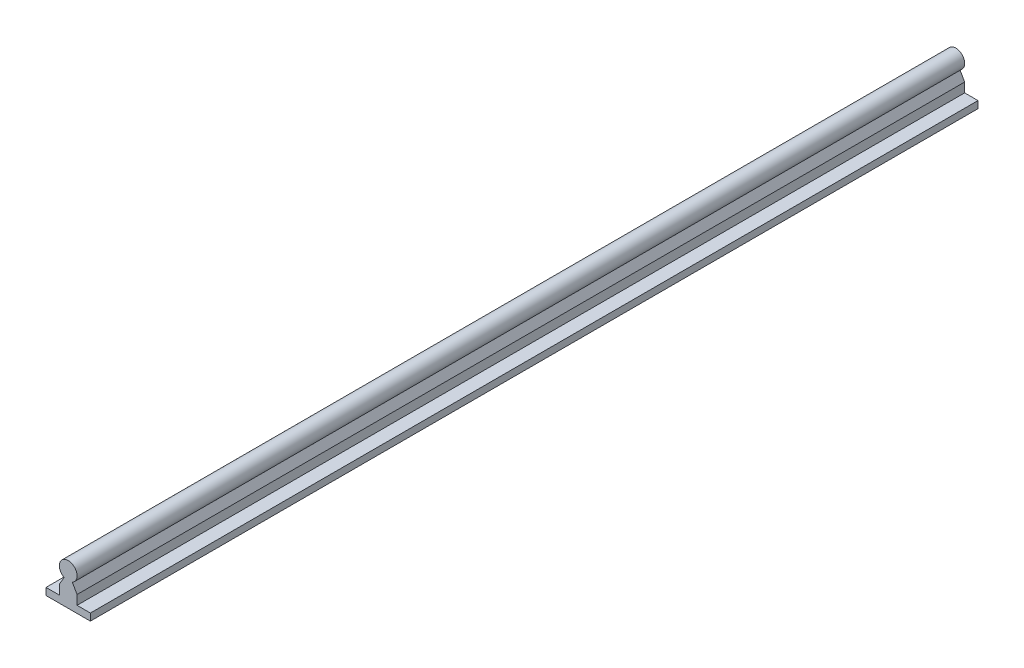
ISO-10303-21;
HEADER;
FILE_DESCRIPTION(('STEP AP214'),'2;1');
FILE_NAME('part.step','',(''),(''),'','','');
FILE_SCHEMA(('AUTOMOTIVE_DESIGN { 1 0 10303 214 1 1 1 1 }'));
ENDSEC;
DATA;
#1=APPLICATION_CONTEXT('core data for automotive mechanical design processes');
#2=APPLICATION_PROTOCOL_DEFINITION('international standard','automotive_design',2000,#1);
#3=PRODUCT_CONTEXT('',#1,'mechanical');
#4=PRODUCT('Part','Part','',(#3));
#5=PRODUCT_RELATED_PRODUCT_CATEGORY('part','',(#4));
#6=PRODUCT_DEFINITION_FORMATION('','',#4);
#7=PRODUCT_DEFINITION_CONTEXT('part definition',#1,'design');
#8=PRODUCT_DEFINITION('design','',#6,#7);
#9=PRODUCT_DEFINITION_SHAPE('','',#8);
#10=(LENGTH_UNIT() NAMED_UNIT(*) SI_UNIT(.MILLI.,.METRE.));
#11=(NAMED_UNIT(*) PLANE_ANGLE_UNIT() SI_UNIT($,.RADIAN.));
#12=(NAMED_UNIT(*) SI_UNIT($,.STERADIAN.) SOLID_ANGLE_UNIT());
#13=UNCERTAINTY_MEASURE_WITH_UNIT(LENGTH_MEASURE(1.E-05),#10,'distance_accuracy_value','');
#14=(GEOMETRIC_REPRESENTATION_CONTEXT(3) GLOBAL_UNCERTAINTY_ASSIGNED_CONTEXT((#13)) GLOBAL_UNIT_ASSIGNED_CONTEXT((#10,
#11,#12)) REPRESENTATION_CONTEXT('',''));
#15=CARTESIAN_POINT('',(0.,0.,0.));
#16=DIRECTION('',(0.,0.,1.));
#17=DIRECTION('',(1.,0.,0.));
#18=AXIS2_PLACEMENT_3D('',#15,#16,#17);
#19=CARTESIAN_POINT('',(0.,22.,600.));
#20=DIRECTION('',(0.,0.,-1.));
#21=DIRECTION('',(-1.,0.,0.));
#22=AXIS2_PLACEMENT_3D('',#19,#20,#21);
#23=CYLINDRICAL_SURFACE('',#22,6.);
#24=CARTESIAN_POINT('',(0.,22.,0.));
#25=DIRECTION('',(0.,0.,1.));
#26=DIRECTION('',(1.,0.,0.));
#27=AXIS2_PLACEMENT_3D('',#24,#25,#26);
#28=CIRCLE('',#27,6.);
#29=CARTESIAN_POINT('',(2.78301876308681,16.6844749493294,0.));
#30=VERTEX_POINT('',#29);
#31=CARTESIAN_POINT('',(-2.78301876308681,16.6844749493294,0.));
#32=VERTEX_POINT('',#31);
#33=EDGE_CURVE('E141',#30,#32,#28,.T.);
#34=ORIENTED_EDGE('',*,*,#33,.T.);
#35=DIRECTION('',(0.,0.,-1.));
#36=VECTOR('',#35,1.);
#37=CARTESIAN_POINT('',(-2.78301876308681,16.6844749493294,600.));
#38=LINE('',#37,#36);
#39=CARTESIAN_POINT('',(-2.78301876308681,16.6844749493294,600.));
#40=VERTEX_POINT('',#39);
#41=EDGE_CURVE('E11',#40,#32,#38,.T.);
#42=ORIENTED_EDGE('',*,*,#41,.F.);
#43=CARTESIAN_POINT('',(0.,22.,600.));
#44=DIRECTION('',(0.,0.,1.));
#45=DIRECTION('',(1.,0.,0.));
#46=AXIS2_PLACEMENT_3D('',#43,#44,#45);
#47=CIRCLE('',#46,6.);
#48=CARTESIAN_POINT('',(2.78301876308681,16.6844749493294,600.));
#49=VERTEX_POINT('',#48);
#50=EDGE_CURVE('E159',#49,#40,#47,.T.);
#51=ORIENTED_EDGE('',*,*,#50,.F.);
#52=DIRECTION('',(0.,0.,-1.));
#53=VECTOR('',#52,1.);
#54=CARTESIAN_POINT('',(2.78301876308681,16.6844749493294,600.));
#55=LINE('',#54,#53);
#56=EDGE_CURVE('E137',#49,#30,#55,.T.);
#57=ORIENTED_EDGE('',*,*,#56,.T.);
#58=EDGE_LOOP('',(#34,#42,#51,#57));
#59=FACE_BOUND('',#58,.T.);
#60=ADVANCED_FACE('F33',(#59),#23,.T.);
#61=CARTESIAN_POINT('',(-6.,11.1125,600.));
#62=DIRECTION('',(0.866025403784438,-0.500000000000001,0.));
#63=DIRECTION('',(0.500000000000001,0.866025403784438,0.));
#64=AXIS2_PLACEMENT_3D('',#61,#62,#63);
#65=PLANE('',#64);
#66=DIRECTION('',(-0.500000000000001,-0.866025403784438,0.));
#67=VECTOR('',#66,1.);
#68=CARTESIAN_POINT('',(-6.,11.1125,0.));
#69=LINE('',#68,#67);
#70=CARTESIAN_POINT('',(-6.,11.1125,0.));
#71=VERTEX_POINT('',#70);
#72=EDGE_CURVE('E144',#32,#71,#69,.T.);
#73=ORIENTED_EDGE('',*,*,#72,.T.);
#74=DIRECTION('',(0.,0.,-1.));
#75=VECTOR('',#74,1.);
#76=CARTESIAN_POINT('',(-6.,11.1125,600.));
#77=LINE('',#76,#75);
#78=CARTESIAN_POINT('',(-6.,11.1125,600.));
#79=VERTEX_POINT('',#78);
#80=EDGE_CURVE('E41',#79,#71,#77,.T.);
#81=ORIENTED_EDGE('',*,*,#80,.F.);
#82=DIRECTION('',(-0.500000000000001,-0.866025403784438,0.));
#83=VECTOR('',#82,1.);
#84=CARTESIAN_POINT('',(-6.,11.1125,600.));
#85=LINE('',#84,#83);
#86=EDGE_CURVE('E98',#40,#79,#85,.T.);
#87=ORIENTED_EDGE('',*,*,#86,.F.);
#88=ORIENTED_EDGE('',*,*,#41,.T.);
#89=EDGE_LOOP('',(#73,#81,#87,#88));
#90=FACE_BOUND('',#89,.T.);
#91=ADVANCED_FACE('F208',(#90),#65,.F.);
#92=CARTESIAN_POINT('',(-6.,4.7625,600.));
#93=DIRECTION('',(1.,0.,0.));
#94=DIRECTION('',(0.,0.,-1.));
#95=AXIS2_PLACEMENT_3D('',#92,#93,#94);
#96=PLANE('',#95);
#97=DIRECTION('',(0.,-1.,0.));
#98=VECTOR('',#97,1.);
#99=CARTESIAN_POINT('',(-6.,4.7625,0.));
#100=LINE('',#99,#98);
#101=CARTESIAN_POINT('',(-6.,4.7625,0.));
#102=VERTEX_POINT('',#101);
#103=EDGE_CURVE('E146',#71,#102,#100,.T.);
#104=ORIENTED_EDGE('',*,*,#103,.T.);
#105=DIRECTION('',(0.,0.,-1.));
#106=VECTOR('',#105,1.);
#107=CARTESIAN_POINT('',(-6.,4.7625,600.));
#108=LINE('',#107,#106);
#109=CARTESIAN_POINT('',(-6.,4.7625,600.));
#110=VERTEX_POINT('',#109);
#111=EDGE_CURVE('E172',#110,#102,#108,.T.);
#112=ORIENTED_EDGE('',*,*,#111,.F.);
#113=DIRECTION('',(0.,-1.,0.));
#114=VECTOR('',#113,1.);
#115=CARTESIAN_POINT('',(-6.,4.7625,600.));
#116=LINE('',#115,#114);
#117=EDGE_CURVE('E180',#79,#110,#116,.T.);
#118=ORIENTED_EDGE('',*,*,#117,.F.);
#119=ORIENTED_EDGE('',*,*,#80,.T.);
#120=EDGE_LOOP('',(#104,#112,#118,#119));
#121=FACE_BOUND('',#120,.T.);
#122=ADVANCED_FACE('F178',(#121),#96,.F.);
#123=CARTESIAN_POINT('',(-15.,4.7625,600.));
#124=DIRECTION('',(0.,-1.,0.));
#125=DIRECTION('',(0.,0.,-1.));
#126=AXIS2_PLACEMENT_3D('',#123,#124,#125);
#127=PLANE('',#126);
#128=DIRECTION('',(-1.,0.,0.));
#129=VECTOR('',#128,1.);
#130=CARTESIAN_POINT('',(-15.,4.7625,0.));
#131=LINE('',#130,#129);
#132=CARTESIAN_POINT('',(-15.,4.7625,0.));
#133=VERTEX_POINT('',#132);
#134=EDGE_CURVE('E148',#102,#133,#131,.T.);
#135=ORIENTED_EDGE('',*,*,#134,.T.);
#136=DIRECTION('',(0.,0.,-1.));
#137=VECTOR('',#136,1.);
#138=CARTESIAN_POINT('',(-15.,4.7625,600.));
#139=LINE('',#138,#137);
#140=CARTESIAN_POINT('',(-15.,4.7625,600.));
#141=VERTEX_POINT('',#140);
#142=EDGE_CURVE('E169',#141,#133,#139,.T.);
#143=ORIENTED_EDGE('',*,*,#142,.F.);
#144=DIRECTION('',(-1.,0.,0.));
#145=VECTOR('',#144,1.);
#146=CARTESIAN_POINT('',(-15.,4.7625,600.));
#147=LINE('',#146,#145);
#148=EDGE_CURVE('E198',#110,#141,#147,.T.);
#149=ORIENTED_EDGE('',*,*,#148,.F.);
#150=ORIENTED_EDGE('',*,*,#111,.T.);
#151=EDGE_LOOP('',(#135,#143,#149,#150));
#152=FACE_BOUND('',#151,.T.);
#153=ADVANCED_FACE('F189',(#152),#127,.F.);
#154=CARTESIAN_POINT('',(-15.,0.,600.));
#155=DIRECTION('',(1.,0.,0.));
#156=DIRECTION('',(0.,0.,-1.));
#157=AXIS2_PLACEMENT_3D('',#154,#155,#156);
#158=PLANE('',#157);
#159=DIRECTION('',(0.,-1.,0.));
#160=VECTOR('',#159,1.);
#161=CARTESIAN_POINT('',(-15.,0.,0.));
#162=LINE('',#161,#160);
#163=CARTESIAN_POINT('',(-15.,0.,0.));
#164=VERTEX_POINT('',#163);
#165=EDGE_CURVE('E150',#133,#164,#162,.T.);
#166=ORIENTED_EDGE('',*,*,#165,.T.);
#167=DIRECTION('',(0.,0.,-1.));
#168=VECTOR('',#167,1.);
#169=CARTESIAN_POINT('',(-15.,0.,600.));
#170=LINE('',#169,#168);
#171=CARTESIAN_POINT('',(-15.,0.,600.));
#172=VERTEX_POINT('',#171);
#173=EDGE_CURVE('E166',#172,#164,#170,.T.);
#174=ORIENTED_EDGE('',*,*,#173,.F.);
#175=DIRECTION('',(0.,-1.,0.));
#176=VECTOR('',#175,1.);
#177=CARTESIAN_POINT('',(-15.,0.,600.));
#178=LINE('',#177,#176);
#179=EDGE_CURVE('E195',#141,#172,#178,.T.);
#180=ORIENTED_EDGE('',*,*,#179,.F.);
#181=ORIENTED_EDGE('',*,*,#142,.T.);
#182=EDGE_LOOP('',(#166,#174,#180,#181));
#183=FACE_BOUND('',#182,.T.);
#184=ADVANCED_FACE('F193',(#183),#158,.F.);
#185=CARTESIAN_POINT('',(15.,0.,600.));
#186=DIRECTION('',(0.,1.,0.));
#187=DIRECTION('',(0.,0.,1.));
#188=AXIS2_PLACEMENT_3D('',#185,#186,#187);
#189=PLANE('',#188);
#190=DIRECTION('',(1.,0.,0.));
#191=VECTOR('',#190,1.);
#192=CARTESIAN_POINT('',(15.,0.,0.));
#193=LINE('',#192,#191);
#194=CARTESIAN_POINT('',(15.,0.,0.));
#195=VERTEX_POINT('',#194);
#196=EDGE_CURVE('E152',#164,#195,#193,.T.);
#197=ORIENTED_EDGE('',*,*,#196,.T.);
#198=DIRECTION('',(0.,0.,-1.));
#199=VECTOR('',#198,1.);
#200=CARTESIAN_POINT('',(15.,0.,600.));
#201=LINE('',#200,#199);
#202=CARTESIAN_POINT('',(15.,0.,600.));
#203=VERTEX_POINT('',#202);
#204=EDGE_CURVE('E163',#203,#195,#201,.T.);
#205=ORIENTED_EDGE('',*,*,#204,.F.);
#206=DIRECTION('',(1.,0.,0.));
#207=VECTOR('',#206,1.);
#208=CARTESIAN_POINT('',(15.,0.,600.));
#209=LINE('',#208,#207);
#210=EDGE_CURVE('E197',#172,#203,#209,.T.);
#211=ORIENTED_EDGE('',*,*,#210,.F.);
#212=ORIENTED_EDGE('',*,*,#173,.T.);
#213=EDGE_LOOP('',(#197,#205,#211,#212));
#214=FACE_BOUND('',#213,.T.);
#215=ADVANCED_FACE('F220',(#214),#189,.F.);
#216=CARTESIAN_POINT('',(15.,0.,600.));
#217=DIRECTION('',(-1.,0.,0.));
#218=DIRECTION('',(0.,0.,1.));
#219=AXIS2_PLACEMENT_3D('',#216,#217,#218);
#220=PLANE('',#219);
#221=DIRECTION('',(0.,1.,0.));
#222=VECTOR('',#221,1.);
#223=CARTESIAN_POINT('',(15.,0.,0.));
#224=LINE('',#223,#222);
#225=CARTESIAN_POINT('',(15.,4.7625,0.));
#226=VERTEX_POINT('',#225);
#227=EDGE_CURVE('E154',#195,#226,#224,.T.);
#228=ORIENTED_EDGE('',*,*,#227,.T.);
#229=DIRECTION('',(0.,0.,-1.));
#230=VECTOR('',#229,1.);
#231=CARTESIAN_POINT('',(15.,4.7625,600.));
#232=LINE('',#231,#230);
#233=CARTESIAN_POINT('',(15.,4.7625,600.));
#234=VERTEX_POINT('',#233);
#235=EDGE_CURVE('E132',#234,#226,#232,.T.);
#236=ORIENTED_EDGE('',*,*,#235,.F.);
#237=DIRECTION('',(0.,1.,0.));
#238=VECTOR('',#237,1.);
#239=CARTESIAN_POINT('',(15.,0.,600.));
#240=LINE('',#239,#238);
#241=EDGE_CURVE('E123',#203,#234,#240,.T.);
#242=ORIENTED_EDGE('',*,*,#241,.F.);
#243=ORIENTED_EDGE('',*,*,#204,.T.);
#244=EDGE_LOOP('',(#228,#236,#242,#243));
#245=FACE_BOUND('',#244,.T.);
#246=ADVANCED_FACE('F223',(#245),#220,.F.);
#247=CARTESIAN_POINT('',(15.,4.7625,600.));
#248=DIRECTION('',(0.,-1.,0.));
#249=DIRECTION('',(0.,0.,-1.));
#250=AXIS2_PLACEMENT_3D('',#247,#248,#249);
#251=PLANE('',#250);
#252=DIRECTION('',(-1.,0.,0.));
#253=VECTOR('',#252,1.);
#254=CARTESIAN_POINT('',(15.,4.7625,0.));
#255=LINE('',#254,#253);
#256=CARTESIAN_POINT('',(6.,4.7625,0.));
#257=VERTEX_POINT('',#256);
#258=EDGE_CURVE('E131',#226,#257,#255,.T.);
#259=ORIENTED_EDGE('',*,*,#258,.T.);
#260=DIRECTION('',(0.,0.,-1.));
#261=VECTOR('',#260,1.);
#262=CARTESIAN_POINT('',(6.,4.7625,600.));
#263=LINE('',#262,#261);
#264=CARTESIAN_POINT('',(6.,4.7625,600.));
#265=VERTEX_POINT('',#264);
#266=EDGE_CURVE('E128',#265,#257,#263,.T.);
#267=ORIENTED_EDGE('',*,*,#266,.F.);
#268=DIRECTION('',(-1.,0.,0.));
#269=VECTOR('',#268,1.);
#270=CARTESIAN_POINT('',(15.,4.7625,600.));
#271=LINE('',#270,#269);
#272=EDGE_CURVE('E117',#234,#265,#271,.T.);
#273=ORIENTED_EDGE('',*,*,#272,.F.);
#274=ORIENTED_EDGE('',*,*,#235,.T.);
#275=EDGE_LOOP('',(#259,#267,#273,#274));
#276=FACE_BOUND('',#275,.T.);
#277=ADVANCED_FACE('F129',(#276),#251,.F.);
#278=CARTESIAN_POINT('',(6.,4.7625,600.));
#279=DIRECTION('',(-1.,0.,0.));
#280=DIRECTION('',(0.,0.,1.));
#281=AXIS2_PLACEMENT_3D('',#278,#279,#280);
#282=PLANE('',#281);
#283=DIRECTION('',(0.,1.,0.));
#284=VECTOR('',#283,1.);
#285=CARTESIAN_POINT('',(6.,4.7625,0.));
#286=LINE('',#285,#284);
#287=CARTESIAN_POINT('',(6.,11.1125,0.));
#288=VERTEX_POINT('',#287);
#289=EDGE_CURVE('E84',#257,#288,#286,.T.);
#290=ORIENTED_EDGE('',*,*,#289,.T.);
#291=DIRECTION('',(0.,0.,-1.));
#292=VECTOR('',#291,1.);
#293=CARTESIAN_POINT('',(6.,11.1125,600.));
#294=LINE('',#293,#292);
#295=CARTESIAN_POINT('',(6.,11.1125,600.));
#296=VERTEX_POINT('',#295);
#297=EDGE_CURVE('E133',#296,#288,#294,.T.);
#298=ORIENTED_EDGE('',*,*,#297,.F.);
#299=DIRECTION('',(0.,1.,0.));
#300=VECTOR('',#299,1.);
#301=CARTESIAN_POINT('',(6.,4.7625,600.));
#302=LINE('',#301,#300);
#303=EDGE_CURVE('E121',#265,#296,#302,.T.);
#304=ORIENTED_EDGE('',*,*,#303,.F.);
#305=ORIENTED_EDGE('',*,*,#266,.T.);
#306=EDGE_LOOP('',(#290,#298,#304,#305));
#307=FACE_BOUND('',#306,.T.);
#308=ADVANCED_FACE('F135',(#307),#282,.F.);
#309=CARTESIAN_POINT('',(6.,11.1125,600.));
#310=DIRECTION('',(-0.866025403784438,-0.500000000000001,0.));
#311=DIRECTION('',(0.500000000000001,-0.866025403784438,0.));
#312=AXIS2_PLACEMENT_3D('',#309,#310,#311);
#313=PLANE('',#312);
#314=DIRECTION('',(-0.500000000000001,0.866025403784438,0.));
#315=VECTOR('',#314,1.);
#316=CARTESIAN_POINT('',(6.,11.1125,0.));
#317=LINE('',#316,#315);
#318=EDGE_CURVE('E90',#288,#30,#317,.T.);
#319=ORIENTED_EDGE('',*,*,#318,.T.);
#320=ORIENTED_EDGE('',*,*,#56,.F.);
#321=DIRECTION('',(-0.500000000000001,0.866025403784438,0.));
#322=VECTOR('',#321,1.);
#323=CARTESIAN_POINT('',(6.,11.1125,600.));
#324=LINE('',#323,#322);
#325=EDGE_CURVE('E49',#296,#49,#324,.T.);
#326=ORIENTED_EDGE('',*,*,#325,.F.);
#327=ORIENTED_EDGE('',*,*,#297,.T.);
#328=EDGE_LOOP('',(#319,#320,#326,#327));
#329=FACE_BOUND('',#328,.T.);
#330=ADVANCED_FACE('F232',(#329),#313,.F.);
#331=CARTESIAN_POINT('',(0.,22.,600.));
#332=DIRECTION('',(0.,0.,1.));
#333=DIRECTION('',(1.,0.,0.));
#334=AXIS2_PLACEMENT_3D('',#331,#332,#333);
#335=PLANE('',#334);
#336=ORIENTED_EDGE('',*,*,#50,.T.);
#337=ORIENTED_EDGE('',*,*,#86,.T.);
#338=ORIENTED_EDGE('',*,*,#117,.T.);
#339=ORIENTED_EDGE('',*,*,#148,.T.);
#340=ORIENTED_EDGE('',*,*,#179,.T.);
#341=ORIENTED_EDGE('',*,*,#210,.T.);
#342=ORIENTED_EDGE('',*,*,#241,.T.);
#343=ORIENTED_EDGE('',*,*,#272,.T.);
#344=ORIENTED_EDGE('',*,*,#303,.T.);
#345=ORIENTED_EDGE('',*,*,#325,.T.);
#346=EDGE_LOOP('',(#336,#337,#338,#339,#340,#341,#342,#343,#344,#345));
#347=FACE_BOUND('',#346,.T.);
#348=ADVANCED_FACE('F119',(#347),#335,.T.);
#349=CARTESIAN_POINT('',(0.,22.,0.));
#350=DIRECTION('',(0.,0.,1.));
#351=DIRECTION('',(1.,0.,0.));
#352=AXIS2_PLACEMENT_3D('',#349,#350,#351);
#353=PLANE('',#352);
#354=ORIENTED_EDGE('',*,*,#33,.F.);
#355=ORIENTED_EDGE('',*,*,#318,.F.);
#356=ORIENTED_EDGE('',*,*,#289,.F.);
#357=ORIENTED_EDGE('',*,*,#258,.F.);
#358=ORIENTED_EDGE('',*,*,#227,.F.);
#359=ORIENTED_EDGE('',*,*,#196,.F.);
#360=ORIENTED_EDGE('',*,*,#165,.F.);
#361=ORIENTED_EDGE('',*,*,#134,.F.);
#362=ORIENTED_EDGE('',*,*,#103,.F.);
#363=ORIENTED_EDGE('',*,*,#72,.F.);
#364=EDGE_LOOP('',(#354,#355,#356,#357,#358,#359,#360,#361,#362,#363));
#365=FACE_BOUND('',#364,.T.);
#366=ADVANCED_FACE('F184',(#365),#353,.F.);
#367=CLOSED_SHELL('',(#60,#91,#122,#153,#184,#215,#246,#277,#308,#330,#348,#366));
#368=MANIFOLD_SOLID_BREP('B2',#367);
#369=ADVANCED_BREP_SHAPE_REPRESENTATION('',(#18,#368),#14);
#370=SHAPE_DEFINITION_REPRESENTATION(#9,#369);
ENDSEC;
END-ISO-10303-21;
